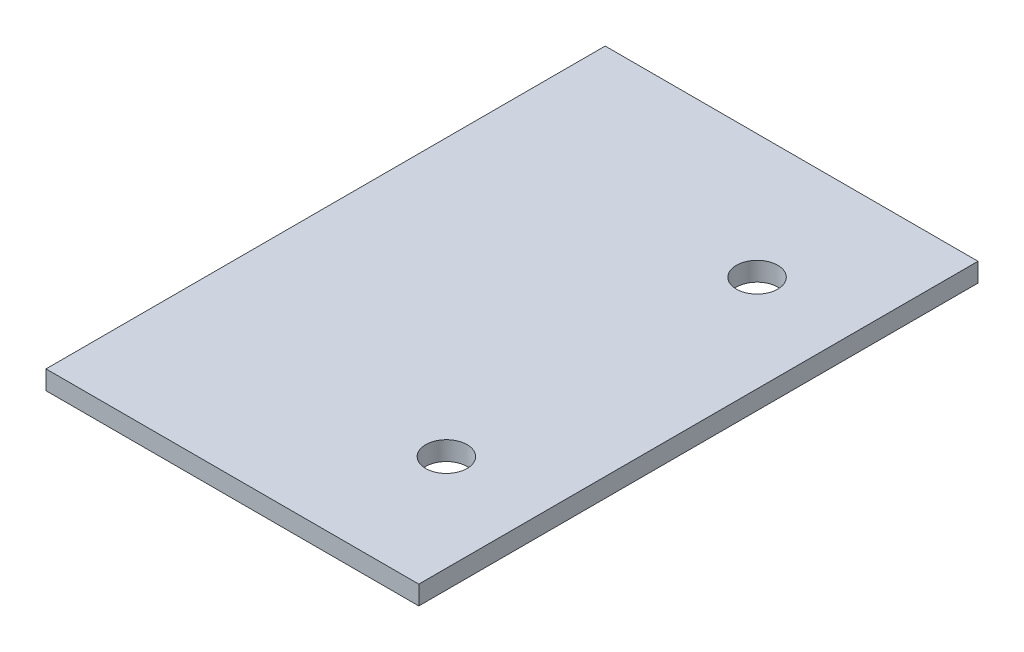
ISO-10303-21;
HEADER;
FILE_DESCRIPTION(('STEP AP214'),'2;1');
FILE_NAME('part.step','',(''),(''),'','','');
FILE_SCHEMA(('AUTOMOTIVE_DESIGN { 1 0 10303 214 1 1 1 1 }'));
ENDSEC;
DATA;
#1=APPLICATION_CONTEXT('core data for automotive mechanical design processes');
#2=APPLICATION_PROTOCOL_DEFINITION('international standard','automotive_design',2000,#1);
#3=PRODUCT_CONTEXT('',#1,'mechanical');
#4=PRODUCT('Part','Part','',(#3));
#5=PRODUCT_RELATED_PRODUCT_CATEGORY('part','',(#4));
#6=PRODUCT_DEFINITION_FORMATION('','',#4);
#7=PRODUCT_DEFINITION_CONTEXT('part definition',#1,'design');
#8=PRODUCT_DEFINITION('design','',#6,#7);
#9=PRODUCT_DEFINITION_SHAPE('','',#8);
#10=(LENGTH_UNIT() NAMED_UNIT(*) SI_UNIT(.MILLI.,.METRE.));
#11=(NAMED_UNIT(*) PLANE_ANGLE_UNIT() SI_UNIT($,.RADIAN.));
#12=(NAMED_UNIT(*) SI_UNIT($,.STERADIAN.) SOLID_ANGLE_UNIT());
#13=UNCERTAINTY_MEASURE_WITH_UNIT(LENGTH_MEASURE(1.E-05),#10,'distance_accuracy_value','');
#14=(GEOMETRIC_REPRESENTATION_CONTEXT(3) GLOBAL_UNCERTAINTY_ASSIGNED_CONTEXT((#13)) GLOBAL_UNIT_ASSIGNED_CONTEXT((#10,
#11,#12)) REPRESENTATION_CONTEXT('',''));
#15=CARTESIAN_POINT('',(0.,0.,0.));
#16=DIRECTION('',(0.,0.,1.));
#17=DIRECTION('',(1.,0.,0.));
#18=AXIS2_PLACEMENT_3D('',#15,#16,#17);
#19=CARTESIAN_POINT('',(15.,1.52399999999997,-22.5));
#20=DIRECTION('',(-1.,0.,0.));
#21=DIRECTION('',(0.,0.,1.));
#22=AXIS2_PLACEMENT_3D('',#19,#20,#21);
#23=PLANE('',#22);
#24=DIRECTION('',(0.,0.,-1.));
#25=VECTOR('',#24,1.);
#26=CARTESIAN_POINT('',(15.,0.,-22.5));
#27=LINE('',#26,#25);
#28=CARTESIAN_POINT('',(15.,0.,22.5));
#29=VERTEX_POINT('',#28);
#30=CARTESIAN_POINT('',(15.,0.,-22.5));
#31=VERTEX_POINT('',#30);
#32=EDGE_CURVE('E97',#29,#31,#27,.T.);
#33=ORIENTED_EDGE('',*,*,#32,.T.);
#34=DIRECTION('',(0.,-1.,0.));
#35=VECTOR('',#34,1.);
#36=CARTESIAN_POINT('',(15.,1.52399999999997,-22.5));
#37=LINE('',#36,#35);
#38=CARTESIAN_POINT('',(15.,1.52399999999997,-22.5));
#39=VERTEX_POINT('',#38);
#40=EDGE_CURVE('E11',#39,#31,#37,.T.);
#41=ORIENTED_EDGE('',*,*,#40,.F.);
#42=DIRECTION('',(0.,0.,-1.));
#43=VECTOR('',#42,1.);
#44=CARTESIAN_POINT('',(15.,1.52399999999997,-22.5));
#45=LINE('',#44,#43);
#46=CARTESIAN_POINT('',(15.0000000000001,1.52399999999997,22.5));
#47=VERTEX_POINT('',#46);
#48=EDGE_CURVE('E85',#47,#39,#45,.T.);
#49=ORIENTED_EDGE('',*,*,#48,.F.);
#50=DIRECTION('',(0.,-1.,0.));
#51=VECTOR('',#50,1.);
#52=CARTESIAN_POINT('',(15.0000000000001,1.52399999999997,22.5));
#53=LINE('',#52,#51);
#54=EDGE_CURVE('E93',#47,#29,#53,.T.);
#55=ORIENTED_EDGE('',*,*,#54,.T.);
#56=EDGE_LOOP('',(#33,#41,#49,#55));
#57=FACE_BOUND('',#56,.T.);
#58=ADVANCED_FACE('F34',(#57),#23,.F.);
#59=CARTESIAN_POINT('',(-15.,1.52399999999996,-22.5));
#60=DIRECTION('',(0.,0.,1.));
#61=DIRECTION('',(1.,0.,0.));
#62=AXIS2_PLACEMENT_3D('',#59,#60,#61);
#63=PLANE('',#62);
#64=DIRECTION('',(-1.,0.,0.));
#65=VECTOR('',#64,1.);
#66=CARTESIAN_POINT('',(-15.,0.,-22.5));
#67=LINE('',#66,#65);
#68=CARTESIAN_POINT('',(-15.,0.,-22.5));
#69=VERTEX_POINT('',#68);
#70=EDGE_CURVE('E89',#31,#69,#67,.T.);
#71=ORIENTED_EDGE('',*,*,#70,.T.);
#72=DIRECTION('',(0.,-1.,0.));
#73=VECTOR('',#72,1.);
#74=CARTESIAN_POINT('',(-15.,1.52399999999996,-22.5));
#75=LINE('',#74,#73);
#76=CARTESIAN_POINT('',(-15.,1.52399999999996,-22.5));
#77=VERTEX_POINT('',#76);
#78=EDGE_CURVE('E42',#77,#69,#75,.T.);
#79=ORIENTED_EDGE('',*,*,#78,.F.);
#80=DIRECTION('',(-1.,0.,0.));
#81=VECTOR('',#80,1.);
#82=CARTESIAN_POINT('',(-15.,1.52399999999996,-22.5));
#83=LINE('',#82,#81);
#84=EDGE_CURVE('E80',#39,#77,#83,.T.);
#85=ORIENTED_EDGE('',*,*,#84,.F.);
#86=ORIENTED_EDGE('',*,*,#40,.T.);
#87=EDGE_LOOP('',(#71,#79,#85,#86));
#88=FACE_BOUND('',#87,.T.);
#89=ADVANCED_FACE('F88',(#88),#63,.F.);
#90=CARTESIAN_POINT('',(-15.,1.52399999999996,-22.5));
#91=DIRECTION('',(1.,0.,0.));
#92=DIRECTION('',(0.,0.,-1.));
#93=AXIS2_PLACEMENT_3D('',#90,#91,#92);
#94=PLANE('',#93);
#95=DIRECTION('',(0.,0.,1.));
#96=VECTOR('',#95,1.);
#97=CARTESIAN_POINT('',(-15.,0.,-22.5));
#98=LINE('',#97,#96);
#99=CARTESIAN_POINT('',(-15.,0.,22.5));
#100=VERTEX_POINT('',#99);
#101=EDGE_CURVE('E67',#69,#100,#98,.T.);
#102=ORIENTED_EDGE('',*,*,#101,.T.);
#103=DIRECTION('',(0.,-1.,0.));
#104=VECTOR('',#103,1.);
#105=CARTESIAN_POINT('',(-15.,1.52399999999998,22.5));
#106=LINE('',#105,#104);
#107=CARTESIAN_POINT('',(-15.,1.52399999999998,22.5));
#108=VERTEX_POINT('',#107);
#109=EDGE_CURVE('E90',#108,#100,#106,.T.);
#110=ORIENTED_EDGE('',*,*,#109,.F.);
#111=DIRECTION('',(0.,0.,1.));
#112=VECTOR('',#111,1.);
#113=CARTESIAN_POINT('',(-15.,1.52399999999996,-22.5));
#114=LINE('',#113,#112);
#115=EDGE_CURVE('E83',#77,#108,#114,.T.);
#116=ORIENTED_EDGE('',*,*,#115,.F.);
#117=ORIENTED_EDGE('',*,*,#78,.T.);
#118=EDGE_LOOP('',(#102,#110,#116,#117));
#119=FACE_BOUND('',#118,.T.);
#120=ADVANCED_FACE('F91',(#119),#94,.F.);
#121=CARTESIAN_POINT('',(-15.,1.52399999999998,22.5));
#122=DIRECTION('',(0.,0.,-1.));
#123=DIRECTION('',(-1.,0.,0.));
#124=AXIS2_PLACEMENT_3D('',#121,#122,#123);
#125=PLANE('',#124);
#126=DIRECTION('',(1.,0.,0.));
#127=VECTOR('',#126,1.);
#128=CARTESIAN_POINT('',(-15.,0.,22.5));
#129=LINE('',#128,#127);
#130=EDGE_CURVE('E73',#100,#29,#129,.T.);
#131=ORIENTED_EDGE('',*,*,#130,.T.);
#132=ORIENTED_EDGE('',*,*,#54,.F.);
#133=DIRECTION('',(1.,0.,0.));
#134=VECTOR('',#133,1.);
#135=CARTESIAN_POINT('',(-15.,1.52399999999998,22.5));
#136=LINE('',#135,#134);
#137=EDGE_CURVE('E50',#108,#47,#136,.T.);
#138=ORIENTED_EDGE('',*,*,#137,.F.);
#139=ORIENTED_EDGE('',*,*,#109,.T.);
#140=EDGE_LOOP('',(#131,#132,#138,#139));
#141=FACE_BOUND('',#140,.T.);
#142=ADVANCED_FACE('F105',(#141),#125,.F.);
#143=CARTESIAN_POINT('',(0.,1.52399999999999,0.));
#144=DIRECTION('',(0.,1.,0.));
#145=DIRECTION('',(0.,0.,1.));
#146=AXIS2_PLACEMENT_3D('',#143,#144,#145);
#147=PLANE('',#146);
#148=CARTESIAN_POINT('',(7.22138086569775,1.524,-12.5));
#149=DIRECTION('',(0.,1.,0.));
#150=DIRECTION('',(0.,0.,1.));
#151=AXIS2_PLACEMENT_3D('',#148,#149,#150);
#152=CIRCLE('',#151,1.665);
#153=CARTESIAN_POINT('',(7.22138086569775,1.524,-10.835));
#154=VERTEX_POINT('',#153);
#155=EDGE_CURVE('E114',#154,#154,#152,.T.);
#156=ORIENTED_EDGE('',*,*,#155,.F.);
#157=EDGE_LOOP('',(#156));
#158=FACE_BOUND('',#157,.T.);
#159=CARTESIAN_POINT('',(7.22138086569771,1.524,12.5));
#160=DIRECTION('',(0.,1.,0.));
#161=DIRECTION('',(0.,0.,1.));
#162=AXIS2_PLACEMENT_3D('',#159,#160,#161);
#163=CIRCLE('',#162,1.665);
#164=CARTESIAN_POINT('',(7.22138086569771,1.524,14.165));
#165=VERTEX_POINT('',#164);
#166=EDGE_CURVE('E115',#165,#165,#163,.T.);
#167=ORIENTED_EDGE('',*,*,#166,.F.);
#168=EDGE_LOOP('',(#167));
#169=FACE_BOUND('',#168,.T.);
#170=ORIENTED_EDGE('',*,*,#48,.T.);
#171=ORIENTED_EDGE('',*,*,#84,.T.);
#172=ORIENTED_EDGE('',*,*,#115,.T.);
#173=ORIENTED_EDGE('',*,*,#137,.T.);
#174=EDGE_LOOP('',(#170,#171,#172,#173));
#175=FACE_BOUND('',#174,.T.);
#176=ADVANCED_FACE('F81',(#158,#169,#175),#147,.T.);
#177=CARTESIAN_POINT('',(0.,0.,0.));
#178=DIRECTION('',(0.,1.,0.));
#179=DIRECTION('',(0.,0.,1.));
#180=AXIS2_PLACEMENT_3D('',#177,#178,#179);
#181=PLANE('',#180);
#182=CARTESIAN_POINT('',(7.22138086569775,0.,-12.5));
#183=DIRECTION('',(0.,1.,0.));
#184=DIRECTION('',(0.,0.,1.));
#185=AXIS2_PLACEMENT_3D('',#182,#183,#184);
#186=CIRCLE('',#185,1.665);
#187=CARTESIAN_POINT('',(7.22138086569775,0.,-10.835));
#188=VERTEX_POINT('',#187);
#189=EDGE_CURVE('E100',#188,#188,#186,.F.);
#190=ORIENTED_EDGE('',*,*,#189,.F.);
#191=EDGE_LOOP('',(#190));
#192=FACE_BOUND('',#191,.T.);
#193=CARTESIAN_POINT('',(7.22138086569769,0.,12.5));
#194=DIRECTION('',(0.,1.,0.));
#195=DIRECTION('',(0.,0.,1.));
#196=AXIS2_PLACEMENT_3D('',#193,#194,#195);
#197=CIRCLE('',#196,1.665);
#198=CARTESIAN_POINT('',(7.22138086569769,0.,14.165));
#199=VERTEX_POINT('',#198);
#200=EDGE_CURVE('E111',#199,#199,#197,.F.);
#201=ORIENTED_EDGE('',*,*,#200,.F.);
#202=EDGE_LOOP('',(#201));
#203=FACE_BOUND('',#202,.T.);
#204=ORIENTED_EDGE('',*,*,#32,.F.);
#205=ORIENTED_EDGE('',*,*,#130,.F.);
#206=ORIENTED_EDGE('',*,*,#101,.F.);
#207=ORIENTED_EDGE('',*,*,#70,.F.);
#208=EDGE_LOOP('',(#204,#205,#206,#207));
#209=FACE_BOUND('',#208,.T.);
#210=ADVANCED_FACE('F108',(#192,#203,#209),#181,.F.);
#211=CARTESIAN_POINT('',(7.22138086569769,-0.00100000000002182,12.5));
#212=DIRECTION('',(0.,1.,0.));
#213=DIRECTION('',(0.,0.,1.));
#214=AXIS2_PLACEMENT_3D('',#211,#212,#213);
#215=CYLINDRICAL_SURFACE('',#214,1.665);
#216=ORIENTED_EDGE('',*,*,#166,.T.);
#217=EDGE_LOOP('',(#216));
#218=FACE_BOUND('',#217,.T.);
#219=ORIENTED_EDGE('',*,*,#200,.T.);
#220=EDGE_LOOP('',(#219));
#221=FACE_BOUND('',#220,.T.);
#222=ADVANCED_FACE('F131',(#218,#221),#215,.F.);
#223=CARTESIAN_POINT('',(7.22138086569774,-0.00100000000002182,-12.5));
#224=DIRECTION('',(0.,1.,0.));
#225=DIRECTION('',(0.,0.,1.));
#226=AXIS2_PLACEMENT_3D('',#223,#224,#225);
#227=CYLINDRICAL_SURFACE('',#226,1.665);
#228=ORIENTED_EDGE('',*,*,#155,.T.);
#229=EDGE_LOOP('',(#228));
#230=FACE_BOUND('',#229,.T.);
#231=ORIENTED_EDGE('',*,*,#189,.T.);
#232=EDGE_LOOP('',(#231));
#233=FACE_BOUND('',#232,.T.);
#234=ADVANCED_FACE('F123',(#230,#233),#227,.F.);
#235=CLOSED_SHELL('',(#58,#89,#120,#142,#176,#210,#222,#234));
#236=MANIFOLD_SOLID_BREP('B2',#235);
#237=ADVANCED_BREP_SHAPE_REPRESENTATION('',(#18,#236),#14);
#238=SHAPE_DEFINITION_REPRESENTATION(#9,#237);
ENDSEC;
END-ISO-10303-21;
